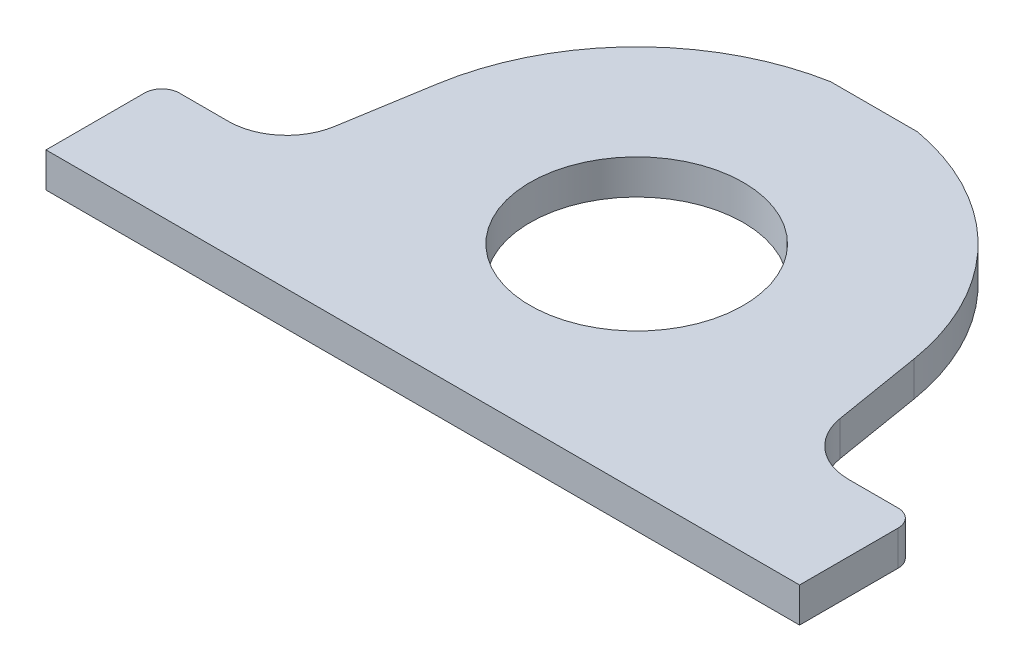
ISO-10303-21;
HEADER;
FILE_DESCRIPTION(('STEP AP214'),'2;1');
FILE_NAME('part.step','',(''),(''),'','','');
FILE_SCHEMA(('AUTOMOTIVE_DESIGN { 1 0 10303 214 1 1 1 1 }'));
ENDSEC;
DATA;
#1=APPLICATION_CONTEXT('core data for automotive mechanical design processes');
#2=APPLICATION_PROTOCOL_DEFINITION('international standard','automotive_design',2000,#1);
#3=PRODUCT_CONTEXT('',#1,'mechanical');
#4=PRODUCT('Part','Part','',(#3));
#5=PRODUCT_RELATED_PRODUCT_CATEGORY('part','',(#4));
#6=PRODUCT_DEFINITION_FORMATION('','',#4);
#7=PRODUCT_DEFINITION_CONTEXT('part definition',#1,'design');
#8=PRODUCT_DEFINITION('design','',#6,#7);
#9=PRODUCT_DEFINITION_SHAPE('','',#8);
#10=(LENGTH_UNIT() NAMED_UNIT(*) SI_UNIT(.MILLI.,.METRE.));
#11=(NAMED_UNIT(*) PLANE_ANGLE_UNIT() SI_UNIT($,.RADIAN.));
#12=(NAMED_UNIT(*) SI_UNIT($,.STERADIAN.) SOLID_ANGLE_UNIT());
#13=UNCERTAINTY_MEASURE_WITH_UNIT(LENGTH_MEASURE(1.E-05),#10,'distance_accuracy_value','');
#14=(GEOMETRIC_REPRESENTATION_CONTEXT(3) GLOBAL_UNCERTAINTY_ASSIGNED_CONTEXT((#13)) GLOBAL_UNIT_ASSIGNED_CONTEXT((#10,
#11,#12)) REPRESENTATION_CONTEXT('',''));
#15=CARTESIAN_POINT('',(0.,0.,0.));
#16=DIRECTION('',(0.,0.,1.));
#17=DIRECTION('',(1.,0.,0.));
#18=AXIS2_PLACEMENT_3D('',#15,#16,#17);
#19=CARTESIAN_POINT('',(0.,30.,0.));
#20=DIRECTION('',(0.,-1.,0.));
#21=DIRECTION('',(0.,0.,-1.));
#22=AXIS2_PLACEMENT_3D('',#19,#20,#21);
#23=CYLINDRICAL_SURFACE('',#22,41.65);
#24=DIRECTION('',(0.,-1.,0.));
#25=VECTOR('',#24,1.);
#26=CARTESIAN_POINT('',(-41.0948202807787,30.,-6.77777589556466));
#27=LINE('',#26,#25);
#28=CARTESIAN_POINT('',(-41.0948202807787,6.,-6.77777589556466));
#29=VERTEX_POINT('',#28);
#30=CARTESIAN_POINT('',(-41.0948202807787,0.,-6.77777589556466));
#31=VERTEX_POINT('',#30);
#32=EDGE_CURVE('E220',#29,#31,#27,.T.);
#33=ORIENTED_EDGE('',*,*,#32,.F.);
#34=CARTESIAN_POINT('',(0.,6.,0.));
#35=DIRECTION('',(0.,-1.,0.));
#36=DIRECTION('',(0.,0.,-1.));
#37=AXIS2_PLACEMENT_3D('',#34,#35,#36);
#38=CIRCLE('',#37,41.65);
#39=CARTESIAN_POINT('',(-7.5,6.,-40.9691652343564));
#40=VERTEX_POINT('',#39);
#41=EDGE_CURVE('E322',#29,#40,#38,.T.);
#42=ORIENTED_EDGE('',*,*,#41,.T.);
#43=DIRECTION('',(0.,-1.,0.));
#44=VECTOR('',#43,1.);
#45=CARTESIAN_POINT('',(-7.5,30.,-40.9691652343564));
#46=LINE('',#45,#44);
#47=CARTESIAN_POINT('',(-7.5,0.,-40.9691652343564));
#48=VERTEX_POINT('',#47);
#49=EDGE_CURVE('E245',#40,#48,#46,.T.);
#50=ORIENTED_EDGE('',*,*,#49,.T.);
#51=CARTESIAN_POINT('',(0.,0.,0.));
#52=DIRECTION('',(0.,1.,0.));
#53=DIRECTION('',(0.,0.,1.));
#54=AXIS2_PLACEMENT_3D('',#51,#52,#53);
#55=CIRCLE('',#54,41.65);
#56=EDGE_CURVE('E213',#48,#31,#55,.T.);
#57=ORIENTED_EDGE('',*,*,#56,.T.);
#58=EDGE_LOOP('',(#33,#42,#50,#57));
#59=FACE_BOUND('',#58,.T.);
#60=ADVANCED_FACE('F37',(#59),#23,.T.);
#61=CARTESIAN_POINT('',(0.,0.,0.));
#62=DIRECTION('',(0.,1.,0.));
#63=DIRECTION('',(0.,0.,1.));
#64=AXIS2_PLACEMENT_3D('',#61,#62,#63);
#65=PLANE('',#64);
#66=DIRECTION('',(-1.,0.,0.));
#67=VECTOR('',#66,1.);
#68=CARTESIAN_POINT('',(45.,0.,16.9));
#69=LINE('',#68,#67);
#70=CARTESIAN_POINT('',(62.,0.,16.9));
#71=VERTEX_POINT('',#70);
#72=CARTESIAN_POINT('',(53.4857955007887,0.,16.9));
#73=VERTEX_POINT('',#72);
#74=EDGE_CURVE('E208',#71,#73,#69,.T.);
#75=ORIENTED_EDGE('',*,*,#74,.F.);
#76=CARTESIAN_POINT('',(62.,0.,19.9));
#77=DIRECTION('',(0.,1.,0.));
#78=DIRECTION('',(0.,0.,1.));
#79=AXIS2_PLACEMENT_3D('',#76,#77,#78);
#80=CIRCLE('',#79,3.);
#81=CARTESIAN_POINT('',(65.,0.,19.9));
#82=VERTEX_POINT('',#81);
#83=EDGE_CURVE('E186',#71,#82,#80,.F.);
#84=ORIENTED_EDGE('',*,*,#83,.T.);
#85=DIRECTION('',(0.,0.,-1.));
#86=VECTOR('',#85,1.);
#87=CARTESIAN_POINT('',(65.,0.,16.9));
#88=LINE('',#87,#86);
#89=CARTESIAN_POINT('',(65.,0.,36.9));
#90=VERTEX_POINT('',#89);
#91=EDGE_CURVE('E200',#90,#82,#88,.T.);
#92=ORIENTED_EDGE('',*,*,#91,.F.);
#93=DIRECTION('',(1.,0.,0.));
#94=VECTOR('',#93,1.);
#95=CARTESIAN_POINT('',(-65.,0.,36.9));
#96=LINE('',#95,#94);
#97=CARTESIAN_POINT('',(-65.,0.,36.9));
#98=VERTEX_POINT('',#97);
#99=EDGE_CURVE('E198',#98,#90,#96,.T.);
#100=ORIENTED_EDGE('',*,*,#99,.F.);
#101=DIRECTION('',(0.,0.,1.));
#102=VECTOR('',#101,1.);
#103=CARTESIAN_POINT('',(-65.,0.,16.9));
#104=LINE('',#103,#102);
#105=CARTESIAN_POINT('',(-65.,0.,19.9));
#106=VERTEX_POINT('',#105);
#107=EDGE_CURVE('E156',#106,#98,#104,.T.);
#108=ORIENTED_EDGE('',*,*,#107,.F.);
#109=CARTESIAN_POINT('',(-62.,0.,19.9));
#110=DIRECTION('',(0.,1.,0.));
#111=DIRECTION('',(0.,0.,1.));
#112=AXIS2_PLACEMENT_3D('',#109,#110,#111);
#113=CIRCLE('',#112,3.);
#114=CARTESIAN_POINT('',(-62.,0.,16.9));
#115=VERTEX_POINT('',#114);
#116=EDGE_CURVE('E59',#106,#115,#113,.F.);
#117=ORIENTED_EDGE('',*,*,#116,.T.);
#118=DIRECTION('',(-1.,0.,0.));
#119=VECTOR('',#118,1.);
#120=CARTESIAN_POINT('',(-65.,0.,16.9));
#121=LINE('',#120,#119);
#122=CARTESIAN_POINT('',(-53.4857955007887,0.,16.9));
#123=VERTEX_POINT('',#122);
#124=EDGE_CURVE('E192',#123,#115,#121,.T.);
#125=ORIENTED_EDGE('',*,*,#124,.F.);
#126=CARTESIAN_POINT('',(-53.4857955007887,0.,6.9));
#127=DIRECTION('',(0.,1.,0.));
#128=DIRECTION('',(0.,0.,1.));
#129=AXIS2_PLACEMENT_3D('',#126,#127,#128);
#130=CIRCLE('',#129,10.);
#131=CARTESIAN_POINT('',(-43.6190919519823,0.,8.52731714179223));
#132=VERTEX_POINT('',#131);
#133=EDGE_CURVE('E176',#123,#132,#130,.T.);
#134=ORIENTED_EDGE('',*,*,#133,.T.);
#135=DIRECTION('',(-0.162731714179224,0.,0.986670354880642));
#136=VECTOR('',#135,1.);
#137=CARTESIAN_POINT('',(-41.0948202807787,0.,-6.77777589556466));
#138=LINE('',#137,#136);
#139=EDGE_CURVE('E217',#31,#132,#138,.T.);
#140=ORIENTED_EDGE('',*,*,#139,.F.);
#141=ORIENTED_EDGE('',*,*,#56,.F.);
#142=DIRECTION('',(-1.,0.,0.));
#143=VECTOR('',#142,1.);
#144=CARTESIAN_POINT('',(7.5,0.,-40.9691652343564));
#145=LINE('',#144,#143);
#146=CARTESIAN_POINT('',(7.5,0.,-40.9691652343564));
#147=VERTEX_POINT('',#146);
#148=EDGE_CURVE('E237',#147,#48,#145,.T.);
#149=ORIENTED_EDGE('',*,*,#148,.F.);
#150=CARTESIAN_POINT('',(41.0948202807787,0.,-6.77777589556467));
#151=VERTEX_POINT('',#150);
#152=EDGE_CURVE('E214',#151,#147,#55,.T.);
#153=ORIENTED_EDGE('',*,*,#152,.F.);
#154=DIRECTION('',(-0.162731714179224,0.,-0.986670354880642));
#155=VECTOR('',#154,1.);
#156=CARTESIAN_POINT('',(41.0948202807787,0.,-6.77777589556467));
#157=LINE('',#156,#155);
#158=CARTESIAN_POINT('',(43.6190919519823,0.,8.52731714179222));
#159=VERTEX_POINT('',#158);
#160=EDGE_CURVE('E210',#159,#151,#157,.T.);
#161=ORIENTED_EDGE('',*,*,#160,.F.);
#162=CARTESIAN_POINT('',(53.4857955007887,0.,6.89999999999999));
#163=DIRECTION('',(0.,1.,0.));
#164=DIRECTION('',(0.,0.,1.));
#165=AXIS2_PLACEMENT_3D('',#162,#163,#164);
#166=CIRCLE('',#165,10.);
#167=EDGE_CURVE('E173',#159,#73,#166,.T.);
#168=ORIENTED_EDGE('',*,*,#167,.T.);
#169=EDGE_LOOP('',(#75,#84,#92,#100,#108,#117,#125,#134,#140,#141,#149,#153,#161,#168));
#170=FACE_BOUND('',#169,.T.);
#171=CARTESIAN_POINT('',(0.,0.,0.));
#172=DIRECTION('',(0.,-1.,0.));
#173=DIRECTION('',(0.,0.,-1.));
#174=AXIS2_PLACEMENT_3D('',#171,#172,#173);
#175=CIRCLE('',#174,18.4);
#176=CARTESIAN_POINT('',(0.,0.,-18.4));
#177=VERTEX_POINT('',#176);
#178=EDGE_CURVE('E202',#177,#177,#175,.T.);
#179=ORIENTED_EDGE('',*,*,#178,.F.);
#180=EDGE_LOOP('',(#179));
#181=FACE_BOUND('',#180,.T.);
#182=ADVANCED_FACE('F195',(#170,#181),#65,.F.);
#183=CARTESIAN_POINT('',(-65.,30.,16.9));
#184=DIRECTION('',(0.,0.,1.));
#185=DIRECTION('',(1.,0.,0.));
#186=AXIS2_PLACEMENT_3D('',#183,#184,#185);
#187=PLANE('',#186);
#188=DIRECTION('',(0.,-1.,0.));
#189=VECTOR('',#188,1.);
#190=CARTESIAN_POINT('',(-62.,30.,16.9));
#191=LINE('',#190,#189);
#192=CARTESIAN_POINT('',(-62.,6.,16.9));
#193=VERTEX_POINT('',#192);
#194=EDGE_CURVE('E45',#115,#193,#191,.F.);
#195=ORIENTED_EDGE('',*,*,#194,.T.);
#196=DIRECTION('',(1.,0.,0.));
#197=VECTOR('',#196,1.);
#198=CARTESIAN_POINT('',(-65.,6.,16.9));
#199=LINE('',#198,#197);
#200=CARTESIAN_POINT('',(-53.4857955007887,6.,16.9));
#201=VERTEX_POINT('',#200);
#202=EDGE_CURVE('E51',#193,#201,#199,.T.);
#203=ORIENTED_EDGE('',*,*,#202,.T.);
#204=DIRECTION('',(0.,-1.,0.));
#205=VECTOR('',#204,1.);
#206=CARTESIAN_POINT('',(-53.4857955007887,0.,16.9));
#207=LINE('',#206,#205);
#208=EDGE_CURVE('E168',#201,#123,#207,.T.);
#209=ORIENTED_EDGE('',*,*,#208,.T.);
#210=ORIENTED_EDGE('',*,*,#124,.T.);
#211=EDGE_LOOP('',(#195,#203,#209,#210));
#212=FACE_BOUND('',#211,.T.);
#213=ADVANCED_FACE('F190',(#212),#187,.F.);
#214=CARTESIAN_POINT('',(-65.,30.,16.9));
#215=DIRECTION('',(1.,0.,0.));
#216=DIRECTION('',(0.,0.,-1.));
#217=AXIS2_PLACEMENT_3D('',#214,#215,#216);
#218=PLANE('',#217);
#219=DIRECTION('',(0.,-1.,0.));
#220=VECTOR('',#219,1.);
#221=CARTESIAN_POINT('',(-65.,30.,36.9));
#222=LINE('',#221,#220);
#223=CARTESIAN_POINT('',(-65.,6.,36.9));
#224=VERTEX_POINT('',#223);
#225=EDGE_CURVE('E151',#224,#98,#222,.T.);
#226=ORIENTED_EDGE('',*,*,#225,.F.);
#227=DIRECTION('',(0.,0.,-1.));
#228=VECTOR('',#227,1.);
#229=CARTESIAN_POINT('',(-65.,6.,16.9));
#230=LINE('',#229,#228);
#231=CARTESIAN_POINT('',(-65.,6.,19.9));
#232=VERTEX_POINT('',#231);
#233=EDGE_CURVE('E137',#224,#232,#230,.T.);
#234=ORIENTED_EDGE('',*,*,#233,.T.);
#235=DIRECTION('',(0.,-1.,0.));
#236=VECTOR('',#235,1.);
#237=CARTESIAN_POINT('',(-65.,30.,19.9));
#238=LINE('',#237,#236);
#239=EDGE_CURVE('E181',#232,#106,#238,.T.);
#240=ORIENTED_EDGE('',*,*,#239,.T.);
#241=ORIENTED_EDGE('',*,*,#107,.T.);
#242=EDGE_LOOP('',(#226,#234,#240,#241));
#243=FACE_BOUND('',#242,.T.);
#244=ADVANCED_FACE('F155',(#243),#218,.F.);
#245=CARTESIAN_POINT('',(-65.,30.,36.9));
#246=DIRECTION('',(0.,0.,-1.));
#247=DIRECTION('',(-1.,0.,0.));
#248=AXIS2_PLACEMENT_3D('',#245,#246,#247);
#249=PLANE('',#248);
#250=DIRECTION('',(0.,-1.,0.));
#251=VECTOR('',#250,1.);
#252=CARTESIAN_POINT('',(65.,30.,36.9));
#253=LINE('',#252,#251);
#254=CARTESIAN_POINT('',(65.,6.,36.9));
#255=VERTEX_POINT('',#254);
#256=EDGE_CURVE('E153',#255,#90,#253,.T.);
#257=ORIENTED_EDGE('',*,*,#256,.F.);
#258=DIRECTION('',(1.,0.,0.));
#259=VECTOR('',#258,1.);
#260=CARTESIAN_POINT('',(-76.9076473506934,6.,36.9));
#261=LINE('',#260,#259);
#262=EDGE_CURVE('E141',#224,#255,#261,.T.);
#263=ORIENTED_EDGE('',*,*,#262,.F.);
#264=ORIENTED_EDGE('',*,*,#225,.T.);
#265=ORIENTED_EDGE('',*,*,#99,.T.);
#266=EDGE_LOOP('',(#257,#263,#264,#265));
#267=FACE_BOUND('',#266,.T.);
#268=ADVANCED_FACE('F149',(#267),#249,.F.);
#269=CARTESIAN_POINT('',(65.,30.,16.9));
#270=DIRECTION('',(-1.,0.,0.));
#271=DIRECTION('',(0.,0.,1.));
#272=AXIS2_PLACEMENT_3D('',#269,#270,#271);
#273=PLANE('',#272);
#274=DIRECTION('',(0.,-1.,0.));
#275=VECTOR('',#274,1.);
#276=CARTESIAN_POINT('',(65.,30.,19.9));
#277=LINE('',#276,#275);
#278=CARTESIAN_POINT('',(65.,6.,19.9));
#279=VERTEX_POINT('',#278);
#280=EDGE_CURVE('E178',#82,#279,#277,.F.);
#281=ORIENTED_EDGE('',*,*,#280,.T.);
#282=DIRECTION('',(0.,0.,1.));
#283=VECTOR('',#282,1.);
#284=CARTESIAN_POINT('',(65.,6.,16.9));
#285=LINE('',#284,#283);
#286=EDGE_CURVE('E248',#279,#255,#285,.T.);
#287=ORIENTED_EDGE('',*,*,#286,.T.);
#288=ORIENTED_EDGE('',*,*,#256,.T.);
#289=ORIENTED_EDGE('',*,*,#91,.T.);
#290=EDGE_LOOP('',(#281,#287,#288,#289));
#291=FACE_BOUND('',#290,.T.);
#292=ADVANCED_FACE('F278',(#291),#273,.F.);
#293=CARTESIAN_POINT('',(45.,30.,16.9));
#294=DIRECTION('',(0.,0.,1.));
#295=DIRECTION('',(1.,0.,0.));
#296=AXIS2_PLACEMENT_3D('',#293,#294,#295);
#297=PLANE('',#296);
#298=DIRECTION('',(0.,-1.,0.));
#299=VECTOR('',#298,1.);
#300=CARTESIAN_POINT('',(53.4857955007887,30.,16.9));
#301=LINE('',#300,#299);
#302=CARTESIAN_POINT('',(53.4857955007887,6.,16.9));
#303=VERTEX_POINT('',#302);
#304=EDGE_CURVE('E160',#73,#303,#301,.F.);
#305=ORIENTED_EDGE('',*,*,#304,.T.);
#306=DIRECTION('',(1.,0.,0.));
#307=VECTOR('',#306,1.);
#308=CARTESIAN_POINT('',(45.,6.,16.9));
#309=LINE('',#308,#307);
#310=CARTESIAN_POINT('',(62.,6.,16.9));
#311=VERTEX_POINT('',#310);
#312=EDGE_CURVE('E308',#303,#311,#309,.T.);
#313=ORIENTED_EDGE('',*,*,#312,.T.);
#314=DIRECTION('',(0.,-1.,0.));
#315=VECTOR('',#314,1.);
#316=CARTESIAN_POINT('',(62.,30.,16.9));
#317=LINE('',#316,#315);
#318=EDGE_CURVE('E183',#311,#71,#317,.T.);
#319=ORIENTED_EDGE('',*,*,#318,.T.);
#320=ORIENTED_EDGE('',*,*,#74,.T.);
#321=EDGE_LOOP('',(#305,#313,#319,#320));
#322=FACE_BOUND('',#321,.T.);
#323=ADVANCED_FACE('F275',(#322),#297,.F.);
#324=CARTESIAN_POINT('',(41.0948202807787,30.,-6.77777589556467));
#325=DIRECTION('',(-0.986670354880642,0.,0.162731714179224));
#326=DIRECTION('',(0.162731714179224,0.,0.986670354880642));
#327=AXIS2_PLACEMENT_3D('',#324,#325,#326);
#328=PLANE('',#327);
#329=DIRECTION('',(0.,-1.,0.));
#330=VECTOR('',#329,1.);
#331=CARTESIAN_POINT('',(41.0948202807787,30.,-6.77777589556467));
#332=LINE('',#331,#330);
#333=CARTESIAN_POINT('',(41.0948202807787,6.,-6.77777589556467));
#334=VERTEX_POINT('',#333);
#335=EDGE_CURVE('E162',#334,#151,#332,.T.);
#336=ORIENTED_EDGE('',*,*,#335,.F.);
#337=DIRECTION('',(0.162731714179224,0.,0.986670354880642));
#338=VECTOR('',#337,1.);
#339=CARTESIAN_POINT('',(41.0948202807787,6.,-6.77777589556467));
#340=LINE('',#339,#338);
#341=CARTESIAN_POINT('',(43.6190919519823,6.,8.52731714179222));
#342=VERTEX_POINT('',#341);
#343=EDGE_CURVE('E314',#334,#342,#340,.T.);
#344=ORIENTED_EDGE('',*,*,#343,.T.);
#345=DIRECTION('',(0.,-1.,0.));
#346=VECTOR('',#345,1.);
#347=CARTESIAN_POINT('',(43.6190919519823,0.,8.52731714179222));
#348=LINE('',#347,#346);
#349=EDGE_CURVE('E158',#342,#159,#348,.T.);
#350=ORIENTED_EDGE('',*,*,#349,.T.);
#351=ORIENTED_EDGE('',*,*,#160,.T.);
#352=EDGE_LOOP('',(#336,#344,#350,#351));
#353=FACE_BOUND('',#352,.T.);
#354=ADVANCED_FACE('F231',(#353),#328,.F.);
#355=DIRECTION('',(0.,-1.,0.));
#356=VECTOR('',#355,1.);
#357=CARTESIAN_POINT('',(7.5,30.,-40.9691652343564));
#358=LINE('',#357,#356);
#359=CARTESIAN_POINT('',(7.5,6.,-40.9691652343564));
#360=VERTEX_POINT('',#359);
#361=EDGE_CURVE('E242',#360,#147,#358,.T.);
#362=ORIENTED_EDGE('',*,*,#361,.F.);
#363=CARTESIAN_POINT('',(0.,6.,0.));
#364=DIRECTION('',(0.,-1.,0.));
#365=DIRECTION('',(0.,0.,-1.));
#366=AXIS2_PLACEMENT_3D('',#363,#364,#365);
#367=CIRCLE('',#366,41.65);
#368=EDGE_CURVE('E227',#360,#334,#367,.T.);
#369=ORIENTED_EDGE('',*,*,#368,.T.);
#370=ORIENTED_EDGE('',*,*,#335,.T.);
#371=ORIENTED_EDGE('',*,*,#152,.T.);
#372=EDGE_LOOP('',(#362,#369,#370,#371));
#373=FACE_BOUND('',#372,.T.);
#374=ADVANCED_FACE('F225',(#373),#23,.T.);
#375=CARTESIAN_POINT('',(-41.0948202807787,30.,-6.77777589556466));
#376=DIRECTION('',(0.986670354880642,0.,0.162731714179224));
#377=DIRECTION('',(0.162731714179224,0.,-0.986670354880642));
#378=AXIS2_PLACEMENT_3D('',#375,#376,#377);
#379=PLANE('',#378);
#380=DIRECTION('',(0.,-1.,0.));
#381=VECTOR('',#380,1.);
#382=CARTESIAN_POINT('',(-43.6190919519823,30.,8.52731714179224));
#383=LINE('',#382,#381);
#384=CARTESIAN_POINT('',(-43.6190919519823,6.,8.52731714179223));
#385=VERTEX_POINT('',#384);
#386=EDGE_CURVE('E170',#132,#385,#383,.F.);
#387=ORIENTED_EDGE('',*,*,#386,.T.);
#388=DIRECTION('',(0.162731714179224,0.,-0.986670354880642));
#389=VECTOR('',#388,1.);
#390=CARTESIAN_POINT('',(-41.0948202807787,6.,-6.77777589556466));
#391=LINE('',#390,#389);
#392=EDGE_CURVE('E325',#385,#29,#391,.T.);
#393=ORIENTED_EDGE('',*,*,#392,.T.);
#394=ORIENTED_EDGE('',*,*,#32,.T.);
#395=ORIENTED_EDGE('',*,*,#139,.T.);
#396=EDGE_LOOP('',(#387,#393,#394,#395));
#397=FACE_BOUND('',#396,.T.);
#398=ADVANCED_FACE('F268',(#397),#379,.F.);
#399=CARTESIAN_POINT('',(0.,12.,0.));
#400=DIRECTION('',(0.,-1.,0.));
#401=DIRECTION('',(0.,0.,-1.));
#402=AXIS2_PLACEMENT_3D('',#399,#400,#401);
#403=CYLINDRICAL_SURFACE('',#402,18.4);
#404=CARTESIAN_POINT('',(0.,6.,0.));
#405=DIRECTION('',(0.,-1.,0.));
#406=DIRECTION('',(0.,0.,-1.));
#407=AXIS2_PLACEMENT_3D('',#404,#405,#406);
#408=CIRCLE('',#407,18.4);
#409=CARTESIAN_POINT('',(0.,6.,-18.4));
#410=VERTEX_POINT('',#409);
#411=EDGE_CURVE('E243',#410,#410,#408,.F.);
#412=ORIENTED_EDGE('',*,*,#411,.T.);
#413=EDGE_LOOP('',(#412));
#414=FACE_BOUND('',#413,.T.);
#415=ORIENTED_EDGE('',*,*,#178,.T.);
#416=EDGE_LOOP('',(#415));
#417=FACE_BOUND('',#416,.T.);
#418=ADVANCED_FACE('F255',(#414,#417),#403,.F.);
#419=CARTESIAN_POINT('',(53.4857955007887,30.,6.89999999999999));
#420=DIRECTION('',(0.,1.,0.));
#421=DIRECTION('',(0.,0.,1.));
#422=AXIS2_PLACEMENT_3D('',#419,#420,#421);
#423=CYLINDRICAL_SURFACE('',#422,10.);
#424=ORIENTED_EDGE('',*,*,#349,.F.);
#425=CARTESIAN_POINT('',(53.4857955007887,6.,6.89999999999999));
#426=DIRECTION('',(0.,-1.,0.));
#427=DIRECTION('',(0.,0.,-1.));
#428=AXIS2_PLACEMENT_3D('',#425,#426,#427);
#429=CIRCLE('',#428,10.);
#430=EDGE_CURVE('E312',#342,#303,#429,.F.);
#431=ORIENTED_EDGE('',*,*,#430,.T.);
#432=ORIENTED_EDGE('',*,*,#304,.F.);
#433=ORIENTED_EDGE('',*,*,#167,.F.);
#434=EDGE_LOOP('',(#424,#431,#432,#433));
#435=FACE_BOUND('',#434,.T.);
#436=ADVANCED_FACE('F287',(#435),#423,.F.);
#437=CARTESIAN_POINT('',(-53.4857955007887,30.,6.9));
#438=DIRECTION('',(0.,1.,0.));
#439=DIRECTION('',(0.,0.,1.));
#440=AXIS2_PLACEMENT_3D('',#437,#438,#439);
#441=CYLINDRICAL_SURFACE('',#440,10.);
#442=ORIENTED_EDGE('',*,*,#208,.F.);
#443=CARTESIAN_POINT('',(-53.4857955007887,6.,6.9));
#444=DIRECTION('',(0.,-1.,0.));
#445=DIRECTION('',(0.,0.,-1.));
#446=AXIS2_PLACEMENT_3D('',#443,#444,#445);
#447=CIRCLE('',#446,10.);
#448=EDGE_CURVE('E328',#201,#385,#447,.F.);
#449=ORIENTED_EDGE('',*,*,#448,.T.);
#450=ORIENTED_EDGE('',*,*,#386,.F.);
#451=ORIENTED_EDGE('',*,*,#133,.F.);
#452=EDGE_LOOP('',(#442,#449,#450,#451));
#453=FACE_BOUND('',#452,.T.);
#454=ADVANCED_FACE('F290',(#453),#441,.F.);
#455=CARTESIAN_POINT('',(7.5,30.,-40.9691652343564));
#456=DIRECTION('',(0.,0.,1.));
#457=DIRECTION('',(1.,0.,0.));
#458=AXIS2_PLACEMENT_3D('',#455,#456,#457);
#459=PLANE('',#458);
#460=ORIENTED_EDGE('',*,*,#49,.F.);
#461=DIRECTION('',(1.,0.,0.));
#462=VECTOR('',#461,1.);
#463=CARTESIAN_POINT('',(7.5,6.,-40.9691652343564));
#464=LINE('',#463,#462);
#465=EDGE_CURVE('E319',#40,#360,#464,.T.);
#466=ORIENTED_EDGE('',*,*,#465,.T.);
#467=ORIENTED_EDGE('',*,*,#361,.T.);
#468=ORIENTED_EDGE('',*,*,#148,.T.);
#469=EDGE_LOOP('',(#460,#466,#467,#468));
#470=FACE_BOUND('',#469,.T.);
#471=ADVANCED_FACE('F293',(#470),#459,.F.);
#472=CARTESIAN_POINT('',(62.,30.,19.9));
#473=DIRECTION('',(0.,-1.,0.));
#474=DIRECTION('',(0.,0.,-1.));
#475=AXIS2_PLACEMENT_3D('',#472,#473,#474);
#476=CYLINDRICAL_SURFACE('',#475,3.);
#477=CARTESIAN_POINT('',(62.,6.,19.9));
#478=DIRECTION('',(0.,-1.,0.));
#479=DIRECTION('',(0.,0.,-1.));
#480=AXIS2_PLACEMENT_3D('',#477,#478,#479);
#481=CIRCLE('',#480,3.);
#482=EDGE_CURVE('E305',#279,#311,#481,.F.);
#483=ORIENTED_EDGE('',*,*,#482,.F.);
#484=ORIENTED_EDGE('',*,*,#280,.F.);
#485=ORIENTED_EDGE('',*,*,#83,.F.);
#486=ORIENTED_EDGE('',*,*,#318,.F.);
#487=EDGE_LOOP('',(#483,#484,#485,#486));
#488=FACE_BOUND('',#487,.T.);
#489=ADVANCED_FACE('F295',(#488),#476,.T.);
#490=CARTESIAN_POINT('',(-62.,30.,19.9));
#491=DIRECTION('',(0.,-1.,0.));
#492=DIRECTION('',(0.,0.,-1.));
#493=AXIS2_PLACEMENT_3D('',#490,#491,#492);
#494=CYLINDRICAL_SURFACE('',#493,3.);
#495=CARTESIAN_POINT('',(-62.,6.,19.9));
#496=DIRECTION('',(0.,-1.,0.));
#497=DIRECTION('',(0.,0.,-1.));
#498=AXIS2_PLACEMENT_3D('',#495,#496,#497);
#499=CIRCLE('',#498,3.);
#500=EDGE_CURVE('E11',#193,#232,#499,.F.);
#501=ORIENTED_EDGE('',*,*,#500,.F.);
#502=ORIENTED_EDGE('',*,*,#194,.F.);
#503=ORIENTED_EDGE('',*,*,#116,.F.);
#504=ORIENTED_EDGE('',*,*,#239,.F.);
#505=EDGE_LOOP('',(#501,#502,#503,#504));
#506=FACE_BOUND('',#505,.T.);
#507=ADVANCED_FACE('F39',(#506),#494,.T.);
#508=CARTESIAN_POINT('',(-76.9076473506934,6.,-56.1));
#509=DIRECTION('',(0.,-1.,0.));
#510=DIRECTION('',(0.,0.,-1.));
#511=AXIS2_PLACEMENT_3D('',#508,#509,#510);
#512=PLANE('',#511);
#513=ORIENTED_EDGE('',*,*,#482,.T.);
#514=ORIENTED_EDGE('',*,*,#312,.F.);
#515=ORIENTED_EDGE('',*,*,#430,.F.);
#516=ORIENTED_EDGE('',*,*,#343,.F.);
#517=ORIENTED_EDGE('',*,*,#368,.F.);
#518=ORIENTED_EDGE('',*,*,#465,.F.);
#519=ORIENTED_EDGE('',*,*,#41,.F.);
#520=ORIENTED_EDGE('',*,*,#392,.F.);
#521=ORIENTED_EDGE('',*,*,#448,.F.);
#522=ORIENTED_EDGE('',*,*,#202,.F.);
#523=ORIENTED_EDGE('',*,*,#500,.T.);
#524=ORIENTED_EDGE('',*,*,#233,.F.);
#525=ORIENTED_EDGE('',*,*,#262,.T.);
#526=ORIENTED_EDGE('',*,*,#286,.F.);
#527=EDGE_LOOP('',(#513,#514,#515,#516,#517,#518,#519,#520,#521,#522,#523,#524,#525,#526));
#528=FACE_BOUND('',#527,.T.);
#529=ORIENTED_EDGE('',*,*,#411,.F.);
#530=EDGE_LOOP('',(#529));
#531=FACE_BOUND('',#530,.T.);
#532=ADVANCED_FACE('F139',(#528,#531),#512,.F.);
#533=CLOSED_SHELL('',(#60,#182,#213,#244,#268,#292,#323,#354,#374,#398,#418,#436,#454,#471,#489,
#507,#532));
#534=MANIFOLD_SOLID_BREP('B2',#533);
#535=ADVANCED_BREP_SHAPE_REPRESENTATION('',(#18,#534),#14);
#536=SHAPE_DEFINITION_REPRESENTATION(#9,#535);
ENDSEC;
END-ISO-10303-21;
